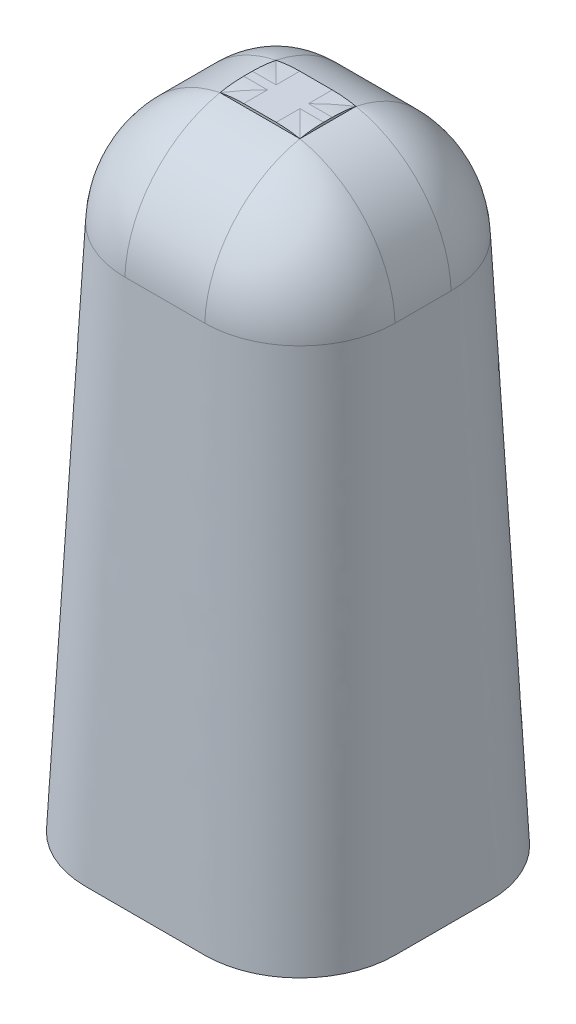
ISO-10303-21;
HEADER;
FILE_DESCRIPTION(('STEP AP214'),'2;1');
FILE_NAME('part.step','',(''),(''),'','','');
FILE_SCHEMA(('AUTOMOTIVE_DESIGN { 1 0 10303 214 1 1 1 1 }'));
ENDSEC;
DATA;
#1=APPLICATION_CONTEXT('core data for automotive mechanical design processes');
#2=APPLICATION_PROTOCOL_DEFINITION('international standard','automotive_design',2000,#1);
#3=PRODUCT_CONTEXT('',#1,'mechanical');
#4=PRODUCT('Part','Part','',(#3));
#5=PRODUCT_RELATED_PRODUCT_CATEGORY('part','',(#4));
#6=PRODUCT_DEFINITION_FORMATION('','',#4);
#7=PRODUCT_DEFINITION_CONTEXT('part definition',#1,'design');
#8=PRODUCT_DEFINITION('design','',#6,#7);
#9=PRODUCT_DEFINITION_SHAPE('','',#8);
#10=(LENGTH_UNIT() NAMED_UNIT(*) SI_UNIT(.MILLI.,.METRE.));
#11=(NAMED_UNIT(*) PLANE_ANGLE_UNIT() SI_UNIT($,.RADIAN.));
#12=(NAMED_UNIT(*) SI_UNIT($,.STERADIAN.) SOLID_ANGLE_UNIT());
#13=UNCERTAINTY_MEASURE_WITH_UNIT(LENGTH_MEASURE(1.E-05),#10,'distance_accuracy_value','');
#14=(GEOMETRIC_REPRESENTATION_CONTEXT(3) GLOBAL_UNCERTAINTY_ASSIGNED_CONTEXT((#13)) GLOBAL_UNIT_ASSIGNED_CONTEXT((#10,
#11,#12)) REPRESENTATION_CONTEXT('',''));
#15=CARTESIAN_POINT('',(0.,0.,0.));
#16=DIRECTION('',(0.,0.,1.));
#17=DIRECTION('',(1.,0.,0.));
#18=AXIS2_PLACEMENT_3D('',#15,#16,#17);
#19=CARTESIAN_POINT('',(1.67833,22.,0.181757005145817));
#20=DIRECTION('',(-1.,0.,0.));
#21=DIRECTION('',(0.,0.,1.));
#22=AXIS2_PLACEMENT_3D('',#19,#20,#21);
#23=CYLINDRICAL_SURFACE('',#22,5.);
#24=DIRECTION('',(-1.,0.,0.));
#25=VECTOR('',#24,1.);
#26=CARTESIAN_POINT('',(1.67833,26.8996777716425,1.17833));
#27=LINE('',#26,#25);
#28=CARTESIAN_POINT('',(-1.67833,26.8996777716425,1.17833));
#29=VERTEX_POINT('',#28);
#30=CARTESIAN_POINT('',(1.67833000000009,26.8996777716425,1.17833058698991));
#31=VERTEX_POINT('',#30);
#32=EDGE_CURVE('E353',#29,#31,#27,.F.);
#33=ORIENTED_EDGE('',*,*,#32,.F.);
#34=CARTESIAN_POINT('',(-1.67833,22.,0.181757005145817));
#35=DIRECTION('',(1.,0.,0.));
#36=DIRECTION('',(0.,0.,-1.));
#37=AXIS2_PLACEMENT_3D('',#34,#35,#36);
#38=CIRCLE('',#37,5.);
#39=CARTESIAN_POINT('',(-1.67833117398021,22.1850583025494,5.17833117397965));
#40=VERTEX_POINT('',#39);
#41=EDGE_CURVE('E914',#29,#40,#38,.T.);
#42=ORIENTED_EDGE('',*,*,#41,.T.);
#43=DIRECTION('',(1.,0.,0.));
#44=VECTOR('',#43,1.);
#45=CARTESIAN_POINT('',(-1.67833117397962,22.1850583025494,5.17833117397965));
#46=LINE('',#45,#44);
#47=CARTESIAN_POINT('',(1.67833117402719,22.1850583025494,5.17833117397965));
#48=VERTEX_POINT('',#47);
#49=EDGE_CURVE('E237',#40,#48,#46,.T.);
#50=ORIENTED_EDGE('',*,*,#49,.T.);
#51=CARTESIAN_POINT('',(1.67833,22.,0.181757005145817));
#52=DIRECTION('',(1.,0.,0.));
#53=DIRECTION('',(0.,0.,-1.));
#54=AXIS2_PLACEMENT_3D('',#51,#52,#53);
#55=CIRCLE('',#54,5.);
#56=EDGE_CURVE('E392',#31,#48,#55,.T.);
#57=ORIENTED_EDGE('',*,*,#56,.F.);
#58=EDGE_LOOP('',(#33,#42,#50,#57));
#59=FACE_BOUND('',#58,.T.);
#60=ADVANCED_FACE('F235',(#59),#23,.T.);
#61=CARTESIAN_POINT('',(-2.5,0.,-2.));
#62=DIRECTION('',(0.,1.,0.));
#63=DIRECTION('',(0.,0.,1.));
#64=AXIS2_PLACEMENT_3D('',#61,#62,#63);
#65=PLANE('',#64);
#66=CARTESIAN_POINT('',(-2.5,0.,-2.));
#67=DIRECTION('',(0.,1.,0.));
#68=DIRECTION('',(0.,0.,1.));
#69=AXIS2_PLACEMENT_3D('',#66,#67,#68);
#70=CIRCLE('',#69,4.);
#71=CARTESIAN_POINT('',(-2.49999999999997,0.,-6.));
#72=VERTEX_POINT('',#71);
#73=CARTESIAN_POINT('',(-6.5,0.,-1.99999999999997));
#74=VERTEX_POINT('',#73);
#75=EDGE_CURVE('E566',#72,#74,#70,.T.);
#76=ORIENTED_EDGE('',*,*,#75,.F.);
#77=DIRECTION('',(1.,0.,0.));
#78=VECTOR('',#77,1.);
#79=CARTESIAN_POINT('',(-2.49999999999997,0.,-6.));
#80=LINE('',#79,#78);
#81=CARTESIAN_POINT('',(2.49999999999997,0.,-6.));
#82=VERTEX_POINT('',#81);
#83=EDGE_CURVE('E500',#72,#82,#80,.T.);
#84=ORIENTED_EDGE('',*,*,#83,.T.);
#85=CARTESIAN_POINT('',(2.5,0.,-2.));
#86=DIRECTION('',(0.,1.,0.));
#87=DIRECTION('',(0.,0.,1.));
#88=AXIS2_PLACEMENT_3D('',#85,#86,#87);
#89=CIRCLE('',#88,4.);
#90=CARTESIAN_POINT('',(6.5,0.,-1.99999999999997));
#91=VERTEX_POINT('',#90);
#92=EDGE_CURVE('E571',#91,#82,#89,.T.);
#93=ORIENTED_EDGE('',*,*,#92,.F.);
#94=DIRECTION('',(0.,0.,1.));
#95=VECTOR('',#94,1.);
#96=CARTESIAN_POINT('',(6.5,0.,-1.99999999999997));
#97=LINE('',#96,#95);
#98=CARTESIAN_POINT('',(6.5,0.,1.99999999999997));
#99=VERTEX_POINT('',#98);
#100=EDGE_CURVE('E652',#91,#99,#97,.T.);
#101=ORIENTED_EDGE('',*,*,#100,.T.);
#102=CARTESIAN_POINT('',(2.5,0.,2.));
#103=DIRECTION('',(0.,1.,0.));
#104=DIRECTION('',(0.,0.,1.));
#105=AXIS2_PLACEMENT_3D('',#102,#103,#104);
#106=CIRCLE('',#105,4.);
#107=CARTESIAN_POINT('',(2.49999999999997,0.,6.));
#108=VERTEX_POINT('',#107);
#109=EDGE_CURVE('E650',#108,#99,#106,.T.);
#110=ORIENTED_EDGE('',*,*,#109,.F.);
#111=DIRECTION('',(1.,0.,0.));
#112=VECTOR('',#111,1.);
#113=CARTESIAN_POINT('',(-2.49999999999997,0.,6.));
#114=LINE('',#113,#112);
#115=CARTESIAN_POINT('',(-2.5,0.,6.));
#116=VERTEX_POINT('',#115);
#117=EDGE_CURVE('E644',#116,#108,#114,.T.);
#118=ORIENTED_EDGE('',*,*,#117,.F.);
#119=CARTESIAN_POINT('',(-2.5,0.,2.));
#120=DIRECTION('',(0.,1.,0.));
#121=DIRECTION('',(0.,0.,1.));
#122=AXIS2_PLACEMENT_3D('',#119,#120,#121);
#123=CIRCLE('',#122,4.);
#124=CARTESIAN_POINT('',(-6.5,0.,1.99999999999997));
#125=VERTEX_POINT('',#124);
#126=EDGE_CURVE('E638',#125,#116,#123,.T.);
#127=ORIENTED_EDGE('',*,*,#126,.F.);
#128=DIRECTION('',(0.,0.,1.));
#129=VECTOR('',#128,1.);
#130=CARTESIAN_POINT('',(-6.5,0.,-1.99999999999997));
#131=LINE('',#130,#129);
#132=EDGE_CURVE('E631',#74,#125,#131,.T.);
#133=ORIENTED_EDGE('',*,*,#132,.F.);
#134=EDGE_LOOP('',(#76,#84,#93,#101,#110,#118,#127,#133));
#135=FACE_BOUND('',#134,.T.);
#136=ADVANCED_FACE('F584',(#135),#65,.F.);
#137=CARTESIAN_POINT('',(-6.5,0.,-1.99999999876504));
#138=CARTESIAN_POINT('',(-5.67833117397965,22.1850583025494,-1.17833117294205));
#139=CARTESIAN_POINT('',(-6.5,0.,-1.71624345960132));
#140=CARTESIAN_POINT('',(-5.67833117397965,22.1850583025494,-0.939921264310687));
#141=CARTESIAN_POINT('',(-6.5,0.,-1.09374244107551));
#142=CARTESIAN_POINT('',(-5.67833117397964,22.1850583025494,-0.54245890887396));
#143=CARTESIAN_POINT('',(-6.5,0.,0.));
#144=CARTESIAN_POINT('',(-5.67833117397966,22.1850583025494,0.));
#145=CARTESIAN_POINT('',(-6.5,0.,1.09374244107551));
#146=CARTESIAN_POINT('',(-5.67833117397965,22.1850583025494,0.542458908873961));
#147=CARTESIAN_POINT('',(-6.5,0.,1.71624345960132));
#148=CARTESIAN_POINT('',(-5.67833117397965,22.1850583025494,0.939921264310688));
#149=CARTESIAN_POINT('',(-6.5,0.,2.57317556480351));
#150=CARTESIAN_POINT('',(-5.67833117397966,22.1850583025494,1.65990856577215));
#151=CARTESIAN_POINT('',(-6.25945428145019,0.,3.63310180142061));
#152=CARTESIAN_POINT('',(-5.50155413761933,22.1850583025493,2.6791236788504));
#153=CARTESIAN_POINT('',(-5.39086823553059,0.,4.89978435194632));
#154=CARTESIAN_POINT('',(-4.59560982485745,22.1850583025494,4.0835425688842));
#155=CARTESIAN_POINT('',(-4.12335089653319,0.,5.76307327082945));
#156=CARTESIAN_POINT('',(-3.19073278397759,22.1850583025493,4.99833929008047));
#157=CARTESIAN_POINT('',(-3.06840569519625,0.,6.));
#158=CARTESIAN_POINT('',(-2.16395151600476,22.1850583025494,5.17833117397965));
#159=CARTESIAN_POINT('',(-2.12814025662968,0.,6.));
#160=CARTESIAN_POINT('',(-1.36063088123626,22.1850583025494,5.17833117397965));
#161=CARTESIAN_POINT('',(-1.32925771033652,0.,6.));
#162=CARTESIAN_POINT('',(-0.792227512739455,22.1850583025494,5.17833117397965));
#163=CARTESIAN_POINT('',(0.,0.,6.));
#164=CARTESIAN_POINT('',(0.,22.1850583025494,5.17833117397965));
#165=CARTESIAN_POINT('',(1.32925771033649,0.,5.99999999999999));
#166=CARTESIAN_POINT('',(0.792227512739425,22.1850583025494,5.17833117397965));
#167=CARTESIAN_POINT('',(2.12814025662965,0.,6.));
#168=CARTESIAN_POINT('',(1.36063088123623,22.1850583025494,5.17833117397965));
#169=CARTESIAN_POINT('',(3.06840569519622,0.,6.));
#170=CARTESIAN_POINT('',(2.16395151600473,22.1850583025494,5.17833117397966));
#171=CARTESIAN_POINT('',(4.12335089653317,0.,5.76307327082945));
#172=CARTESIAN_POINT('',(3.19073278397757,22.1850583025494,4.99833929008049));
#173=CARTESIAN_POINT('',(5.39086823553059,0.,4.89978435194633));
#174=CARTESIAN_POINT('',(4.59560982485744,22.1850583025494,4.0835425688842));
#175=CARTESIAN_POINT('',(6.25945428145019,0.,3.63310180142062));
#176=CARTESIAN_POINT('',(5.50155413761932,22.1850583025494,2.67912367885042));
#177=CARTESIAN_POINT('',(6.5,0.,2.57317556480352));
#178=CARTESIAN_POINT('',(5.67833117397966,22.1850583025494,1.65990856577216));
#179=CARTESIAN_POINT('',(6.5,0.,1.71624345960132));
#180=CARTESIAN_POINT('',(5.67833117397965,22.1850583025494,0.939921264310688));
#181=CARTESIAN_POINT('',(6.5,0.,1.09374244107551));
#182=CARTESIAN_POINT('',(5.67833117397965,22.1850583025493,0.54245890887396));
#183=CARTESIAN_POINT('',(6.49999999999999,0.,0.));
#184=CARTESIAN_POINT('',(5.67833117397965,22.1850583025494,0.));
#185=CARTESIAN_POINT('',(6.50000000000001,0.,-1.09374244107551));
#186=CARTESIAN_POINT('',(5.67833117397965,22.1850583025493,-0.542458908873959));
#187=CARTESIAN_POINT('',(6.5,0.,-1.71624345960132));
#188=CARTESIAN_POINT('',(5.67833117397965,22.1850583025494,-0.939921264310687));
#189=CARTESIAN_POINT('',(6.5,0.,-2.57317556480352));
#190=CARTESIAN_POINT('',(5.67833117397966,22.1850583025494,-1.65990856577216));
#191=CARTESIAN_POINT('',(6.25945428145019,0.,-3.63310180142061));
#192=CARTESIAN_POINT('',(5.50155413761932,22.1850583025494,-2.6791236788504));
#193=CARTESIAN_POINT('',(5.39086823553059,0.,-4.89978435194633));
#194=CARTESIAN_POINT('',(4.59560982485744,22.1850583025494,-4.08354256888422));
#195=CARTESIAN_POINT('',(4.12335089653317,0.,-5.76307327082945));
#196=CARTESIAN_POINT('',(3.19073278397757,22.1850583025494,-4.99833929008048));
#197=CARTESIAN_POINT('',(3.06840569519623,0.,-6.));
#198=CARTESIAN_POINT('',(2.16395151600473,22.1850583025494,-5.17833117397966));
#199=CARTESIAN_POINT('',(2.12814025662966,0.,-6.));
#200=CARTESIAN_POINT('',(1.36063088123623,22.1850583025494,-5.17833117397965));
#201=CARTESIAN_POINT('',(1.32925771033649,0.,-5.99999999999998));
#202=CARTESIAN_POINT('',(0.792227512739432,22.1850583025494,-5.17833117397966));
#203=CARTESIAN_POINT('',(0.,0.,-6.00000000000002));
#204=CARTESIAN_POINT('',(0.,22.1850583025494,-5.17833117397965));
#205=CARTESIAN_POINT('',(-1.3292577103365,0.,-5.99999999999998));
#206=CARTESIAN_POINT('',(-0.792227512739434,22.1850583025494,-5.17833117397966));
#207=CARTESIAN_POINT('',(-2.12814025662965,0.,-6.));
#208=CARTESIAN_POINT('',(-1.36063088123623,22.1850583025494,-5.17833117397965));
#209=CARTESIAN_POINT('',(-3.06840569519622,0.,-6.));
#210=CARTESIAN_POINT('',(-2.16395151600473,22.1850583025494,-5.17833117397966));
#211=CARTESIAN_POINT('',(-4.12335089653317,0.,-5.76307327082946));
#212=CARTESIAN_POINT('',(-3.19073278397757,22.1850583025494,-4.99833929008048));
#213=CARTESIAN_POINT('',(-5.39086823553059,0.,-4.89978435194633));
#214=CARTESIAN_POINT('',(-4.59560982485743,22.1850583025494,-4.08354256888422));
#215=CARTESIAN_POINT('',(-6.25945428145018,0.,-3.63310180142062));
#216=CARTESIAN_POINT('',(-5.50155413761932,22.1850583025494,-2.67912367885041));
#217=CARTESIAN_POINT('',(-6.5,0.,-2.57317556480352));
#218=CARTESIAN_POINT('',(-5.67833117397966,22.1850583025494,-1.65990856577216));
#219=CARTESIAN_POINT('',(-6.5,0.,-1.99999999876504));
#220=CARTESIAN_POINT('',(-5.67833117397965,22.1850583025494,-1.17833117294205));
#221=B_SPLINE_SURFACE_WITH_KNOTS('',3,1,((#137,#138),(#139,#140),(#141,#142),(#143,#144),(#145,
#146),(#147,#148),(#149,#150),(#151,#152),(#153,#154),(#155,#156),(#157,#158),(#159,#160),(#161,
#162),(#163,#164),(#165,#166),(#167,#168),(#169,#170),(#171,#172),(#173,#174),(#175,#176),(#177,
#178),(#179,#180),(#181,#182),(#183,#184),(#185,#186),(#187,#188),(#189,#190),(#191,#192),(#193,
#194),(#195,#196),(#197,#198),(#199,#200),(#201,#202),(#203,#204),(#205,#206),(#207,#208),(#209,
#210),(#211,#212),(#213,#214),(#215,#216),(#217,#218),(#219,#220)),.UNSPECIFIED.,.T.,.F.,.F.,(4,
1,1,1,2,1,1,1,2,1,1,1,2,1,1,1,2,1,1,1,2,1,1,1,2,1,1,1,2,1,1,1,4),(2,2),(0.,0.0196497725721527,
0.0392995451443053,0.058949317716458,0.0785990902886106,0.118290755367992,0.157982420447373,
0.197674085526755,0.237365750606136,0.263332647875221,0.289299545144305,0.315266442413389,
0.341233339682474,0.380925004761855,0.420616669841237,0.460308334920618,0.5,0.519649772572153,
0.539299545144305,0.558949317716458,0.578599090288611,0.618290755367992,0.657982420447374,
0.697674085526755,0.737365750606137,0.763332647875221,0.789299545144305,0.81526644241339,
0.841233339682474,0.880925004761855,0.920616669841237,0.960308334920618,1.),(0.,1.),.UNSPECIFIED.);
#222=DIRECTION('',(1.,0.,0.));
#223=VECTOR('',#222,1.);
#224=CARTESIAN_POINT('',(-1.67833117397962,22.1850583025494,-5.17833117397965));
#225=LINE('',#224,#223);
#226=CARTESIAN_POINT('',(-1.67833,22.1850583025494,-5.17833117397965));
#227=VERTEX_POINT('',#226);
#228=CARTESIAN_POINT('',(1.67833,22.1850583025494,-5.17833117397965));
#229=VERTEX_POINT('',#228);
#230=EDGE_CURVE('E698',#227,#229,#225,.T.);
#231=CARTESIAN_POINT('',(1.67833117397965,22.1850583025494,-1.17833117397965));
#232=DIRECTION('',(0.,1.,0.));
#233=DIRECTION('',(0.,0.,1.));
#234=AXIS2_PLACEMENT_3D('',#231,#232,#233);
#235=CIRCLE('',#234,4.);
#236=CARTESIAN_POINT('',(5.67833117397965,22.1850583025494,-1.17833));
#237=VERTEX_POINT('',#236);
#238=EDGE_CURVE('E468',#237,#229,#235,.T.);
#239=DIRECTION('',(0.,0.,1.));
#240=VECTOR('',#239,1.);
#241=CARTESIAN_POINT('',(5.67833117397965,22.1850583025494,-1.17833117397962));
#242=LINE('',#241,#240);
#243=CARTESIAN_POINT('',(5.67833117397965,22.1850583025494,1.17833));
#244=VERTEX_POINT('',#243);
#245=EDGE_CURVE('E543',#237,#244,#242,.T.);
#246=CARTESIAN_POINT('',(1.67833117397965,22.1850583025494,1.17833117397965));
#247=DIRECTION('',(0.,1.,0.));
#248=DIRECTION('',(0.,0.,1.));
#249=AXIS2_PLACEMENT_3D('',#246,#247,#248);
#250=CIRCLE('',#249,4.);
#251=EDGE_CURVE('E406',#48,#244,#250,.T.);
#252=CARTESIAN_POINT('',(-1.67833117397965,22.1850583025494,1.17833117397965));
#253=DIRECTION('',(0.,1.,0.));
#254=DIRECTION('',(0.,0.,1.));
#255=AXIS2_PLACEMENT_3D('',#252,#253,#254);
#256=CIRCLE('',#255,4.);
#257=CARTESIAN_POINT('',(-5.67833117397965,22.1850583025494,1.17833));
#258=VERTEX_POINT('',#257);
#259=EDGE_CURVE('E505',#258,#40,#256,.T.);
#260=DIRECTION('',(0.,0.,1.));
#261=VECTOR('',#260,1.);
#262=CARTESIAN_POINT('',(-5.67833117397965,22.1850583025494,-1.17833117397962));
#263=LINE('',#262,#261);
#264=CARTESIAN_POINT('',(-5.67833117397965,22.1850583025494,-1.17833117387391));
#265=VERTEX_POINT('',#264);
#266=EDGE_CURVE('E432',#265,#258,#263,.T.);
#267=CARTESIAN_POINT('',(-1.67833117397965,22.1850583025494,-1.17833117397965));
#268=DIRECTION('',(0.,1.,0.));
#269=DIRECTION('',(0.,0.,1.));
#270=AXIS2_PLACEMENT_3D('',#267,#268,#269);
#271=CIRCLE('',#270,4.);
#272=EDGE_CURVE('E495',#227,#265,#271,.T.);
#273=CARTESIAN_POINT('',(0.,0.,6.));
#274=CARTESIAN_POINT('',(0.,22.1850583025494,5.17833117397965));
#275=CARTESIAN_POINT('',(0.443085903445487,0.,6.));
#276=CARTESIAN_POINT('',(0.264075837579799,22.1850583025494,5.17833117397965));
#277=CARTESIAN_POINT('',(1.32925771033649,0.,5.99999999999999));
#278=CARTESIAN_POINT('',(0.792227512739425,22.1850583025494,5.17833117397965));
#279=CARTESIAN_POINT('',(2.12814025662965,0.,6.));
#280=CARTESIAN_POINT('',(1.36063088123623,22.1850583025494,5.17833117397965));
#281=CARTESIAN_POINT('',(3.06840569519622,0.,6.));
#282=CARTESIAN_POINT('',(2.16395151600473,22.1850583025494,5.17833117397966));
#283=CARTESIAN_POINT('',(4.12335089653317,0.,5.76307327082945));
#284=CARTESIAN_POINT('',(3.19073278397757,22.1850583025494,4.99833929008049));
#285=CARTESIAN_POINT('',(5.39086823553059,0.,4.89978435194633));
#286=CARTESIAN_POINT('',(4.59560982485744,22.1850583025494,4.0835425688842));
#287=CARTESIAN_POINT('',(6.25945428145019,0.,3.63310180142062));
#288=CARTESIAN_POINT('',(5.50155413761932,22.1850583025494,2.67912367885042));
#289=CARTESIAN_POINT('',(6.5,0.,2.57317556480352));
#290=CARTESIAN_POINT('',(5.67833117397966,22.1850583025494,1.65990856577216));
#291=CARTESIAN_POINT('',(6.5,0.,1.71624345960132));
#292=CARTESIAN_POINT('',(5.67833117397965,22.1850583025494,0.939921264310688));
#293=CARTESIAN_POINT('',(6.5,0.,1.09374244107551));
#294=CARTESIAN_POINT('',(5.67833117397965,22.1850583025493,0.54245890887396));
#295=CARTESIAN_POINT('',(6.49999999999999,0.,0.));
#296=CARTESIAN_POINT('',(5.67833117397965,22.1850583025494,0.));
#297=CARTESIAN_POINT('',(6.50000000000001,0.,-1.09374244107551));
#298=CARTESIAN_POINT('',(5.67833117397965,22.1850583025493,-0.542458908873959));
#299=CARTESIAN_POINT('',(6.5,0.,-1.71624345960132));
#300=CARTESIAN_POINT('',(5.67833117397965,22.1850583025494,-0.939921264310687));
#301=CARTESIAN_POINT('',(6.5,0.,-2.57317556480352));
#302=CARTESIAN_POINT('',(5.67833117397966,22.1850583025494,-1.65990856577216));
#303=CARTESIAN_POINT('',(6.25945428145019,0.,-3.63310180142061));
#304=CARTESIAN_POINT('',(5.50155413761932,22.1850583025494,-2.6791236788504));
#305=CARTESIAN_POINT('',(5.39086823553059,0.,-4.89978435194633));
#306=CARTESIAN_POINT('',(4.59560982485744,22.1850583025494,-4.08354256888422));
#307=CARTESIAN_POINT('',(4.12335089653317,0.,-5.76307327082945));
#308=CARTESIAN_POINT('',(3.19073278397757,22.1850583025494,-4.99833929008048));
#309=CARTESIAN_POINT('',(3.06840569519623,0.,-6.));
#310=CARTESIAN_POINT('',(2.16395151600473,22.1850583025494,-5.17833117397966));
#311=CARTESIAN_POINT('',(2.12814025662966,0.,-6.));
#312=CARTESIAN_POINT('',(1.36063088123623,22.1850583025494,-5.17833117397965));
#313=CARTESIAN_POINT('',(1.32925771033649,0.,-5.99999999999998));
#314=CARTESIAN_POINT('',(0.792227512739432,22.1850583025494,-5.17833117397966));
#315=CARTESIAN_POINT('',(0.,0.,-6.00000000000002));
#316=CARTESIAN_POINT('',(0.,22.1850583025494,-5.17833117397965));
#317=CARTESIAN_POINT('',(-1.3292577103365,0.,-5.99999999999998));
#318=CARTESIAN_POINT('',(-0.792227512739434,22.1850583025494,-5.17833117397966));
#319=CARTESIAN_POINT('',(-2.12814025662965,0.,-6.));
#320=CARTESIAN_POINT('',(-1.36063088123623,22.1850583025494,-5.17833117397965));
#321=CARTESIAN_POINT('',(-3.06840569519622,0.,-6.));
#322=CARTESIAN_POINT('',(-2.16395151600473,22.1850583025494,-5.17833117397966));
#323=CARTESIAN_POINT('',(-4.12335089653317,0.,-5.76307327082946));
#324=CARTESIAN_POINT('',(-3.19073278397757,22.1850583025494,-4.99833929008048));
#325=CARTESIAN_POINT('',(-5.39086823553059,0.,-4.89978435194633));
#326=CARTESIAN_POINT('',(-4.59560982485743,22.1850583025494,-4.08354256888422));
#327=CARTESIAN_POINT('',(-6.25945428145018,0.,-3.63310180142062));
#328=CARTESIAN_POINT('',(-5.50155413761932,22.1850583025494,-2.67912367885041));
#329=CARTESIAN_POINT('',(-6.5,0.,-2.57317556480352));
#330=CARTESIAN_POINT('',(-5.67833117397966,22.1850583025494,-1.65990856577216));
#331=CARTESIAN_POINT('',(-6.5,0.,-1.71624345960132));
#332=CARTESIAN_POINT('',(-5.67833117397965,22.1850583025494,-0.939921264310687));
#333=CARTESIAN_POINT('',(-6.5,0.,-1.09374244107551));
#334=CARTESIAN_POINT('',(-5.67833117397964,22.1850583025494,-0.54245890887396));
#335=CARTESIAN_POINT('',(-6.5,0.,0.));
#336=CARTESIAN_POINT('',(-5.67833117397966,22.1850583025494,0.));
#337=CARTESIAN_POINT('',(-6.5,0.,1.09374244107551));
#338=CARTESIAN_POINT('',(-5.67833117397965,22.1850583025494,0.542458908873961));
#339=CARTESIAN_POINT('',(-6.5,0.,1.71624345960132));
#340=CARTESIAN_POINT('',(-5.67833117397965,22.1850583025494,0.939921264310688));
#341=CARTESIAN_POINT('',(-6.5,0.,2.57317556480351));
#342=CARTESIAN_POINT('',(-5.67833117397966,22.1850583025494,1.65990856577215));
#343=CARTESIAN_POINT('',(-6.25945428145019,0.,3.63310180142061));
#344=CARTESIAN_POINT('',(-5.50155413761933,22.1850583025493,2.6791236788504));
#345=CARTESIAN_POINT('',(-5.39086823553059,0.,4.89978435194632));
#346=CARTESIAN_POINT('',(-4.59560982485745,22.1850583025494,4.0835425688842));
#347=CARTESIAN_POINT('',(-4.12335089653319,0.,5.76307327082945));
#348=CARTESIAN_POINT('',(-3.19073278397759,22.1850583025493,4.99833929008047));
#349=CARTESIAN_POINT('',(-3.06840569519625,0.,6.));
#350=CARTESIAN_POINT('',(-2.16395151600476,22.1850583025494,5.17833117397965));
#351=CARTESIAN_POINT('',(-2.12814025662968,0.,6.));
#352=CARTESIAN_POINT('',(-1.36063088123626,22.1850583025494,5.17833117397965));
#353=CARTESIAN_POINT('',(-1.32925771033652,0.,6.));
#354=CARTESIAN_POINT('',(-0.792227512739455,22.1850583025494,5.17833117397965));
#355=CARTESIAN_POINT('',(-0.443085903445515,0.,6.));
#356=CARTESIAN_POINT('',(-0.264075837579828,22.1850583025494,5.17833117397965));
#357=CARTESIAN_POINT('',(0.,0.,6.));
#358=CARTESIAN_POINT('',(0.,22.1850583025494,5.17833117397965));
#359=B_SPLINE_SURFACE_WITH_KNOTS('',3,1,((#273,#274),(#275,#276),(#277,#278),(#279,#280),(#281,
#282),(#283,#284),(#285,#286),(#287,#288),(#289,#290),(#291,#292),(#293,#294),(#295,#296),(#297,
#298),(#299,#300),(#301,#302),(#303,#304),(#305,#306),(#307,#308),(#309,#310),(#311,#312),(#313,
#314),(#315,#316),(#317,#318),(#319,#320),(#321,#322),(#323,#324),(#325,#326),(#327,#328),(#329,
#330),(#331,#332),(#333,#334),(#335,#336),(#337,#338),(#339,#340),(#341,#342),(#343,#344),(#345,
#346),(#347,#348),(#349,#350),(#351,#352),(#353,#354),(#355,#356),(#357,#358)),.UNSPECIFIED.,
.T.,.F.,.F.,(4,1,2,1,1,1,2,1,1,1,2,1,1,1,2,1,1,1,2,1,1,1,2,1,1,1,2,1,1,1,2,1,4),(2,2),
(0.289299545144305,0.315266442413389,0.341233339682474,0.380925004761855,0.420616669841237,
0.460308334920618,0.5,0.519649772572153,0.539299545144305,0.558949317716458,0.578599090288611,
0.618290755367992,0.657982420447374,0.697674085526755,0.737365750606137,0.763332647875221,
0.789299545144305,0.81526644241339,0.841233339682474,0.880925004761855,0.920616669841237,
0.960308334920618,1.,1.01964977257215,1.03929954514431,1.05894931771646,1.07859909028861,
1.11829075536799,1.15798242044737,1.19767408552675,1.23736575060614,1.26333264787522,
1.28929954514431),(0.,1.),.UNSPECIFIED.);
#360=ORIENTED_EDGE('',*,*,#75,.T.);
#361=ORIENTED_EDGE('',*,*,#132,.T.);
#362=ORIENTED_EDGE('',*,*,#126,.T.);
#363=ORIENTED_EDGE('',*,*,#117,.T.);
#364=ORIENTED_EDGE('',*,*,#109,.T.);
#365=ORIENTED_EDGE('',*,*,#100,.F.);
#366=ORIENTED_EDGE('',*,*,#92,.T.);
#367=ORIENTED_EDGE('',*,*,#83,.F.);
#368=EDGE_LOOP('',(#360,#361,#362,#363,#364,#365,#366,#367));
#369=FACE_BOUND('',#368,.T.);
#370=ORIENTED_EDGE('',*,*,#230,.T.);
#371=ORIENTED_EDGE('',*,*,#238,.F.);
#372=ORIENTED_EDGE('',*,*,#245,.T.);
#373=ORIENTED_EDGE('',*,*,#251,.F.);
#374=ORIENTED_EDGE('',*,*,#49,.F.);
#375=ORIENTED_EDGE('',*,*,#259,.F.);
#376=ORIENTED_EDGE('',*,*,#266,.F.);
#377=ORIENTED_EDGE('',*,*,#272,.F.);
#378=EDGE_LOOP('',(#370,#371,#372,#373,#374,#375,#376,#377));
#379=FACE_BOUND('',#378,.T.);
#380=ADVANCED_FACE('F234',(#369,#379),#359,.T.);
#381=CARTESIAN_POINT('',(1.67833,22.,-0.181757005145817));
#382=DIRECTION('',(-1.,0.,0.));
#383=DIRECTION('',(0.,0.,1.));
#384=AXIS2_PLACEMENT_3D('',#381,#382,#383);
#385=CYLINDRICAL_SURFACE('',#384,5.);
#386=CARTESIAN_POINT('',(-1.67833,22.,-0.181757005145817));
#387=DIRECTION('',(1.,0.,0.));
#388=DIRECTION('',(0.,0.,-1.));
#389=AXIS2_PLACEMENT_3D('',#386,#387,#388);
#390=CIRCLE('',#389,5.);
#391=CARTESIAN_POINT('',(-1.67833,26.8996777716425,-1.17833058698983));
#392=VERTEX_POINT('',#391);
#393=EDGE_CURVE('E489',#227,#392,#390,.T.);
#394=ORIENTED_EDGE('',*,*,#393,.T.);
#395=DIRECTION('',(-1.,0.,0.));
#396=VECTOR('',#395,1.);
#397=CARTESIAN_POINT('',(1.67833,26.8996777716425,-1.17833));
#398=LINE('',#397,#396);
#399=CARTESIAN_POINT('',(1.67833058699,26.8996777716425,-1.17833000000017));
#400=VERTEX_POINT('',#399);
#401=EDGE_CURVE('E365',#392,#400,#398,.F.);
#402=ORIENTED_EDGE('',*,*,#401,.T.);
#403=CARTESIAN_POINT('',(1.67833,22.,-0.181757005145817));
#404=DIRECTION('',(1.,0.,0.));
#405=DIRECTION('',(0.,0.,-1.));
#406=AXIS2_PLACEMENT_3D('',#403,#404,#405);
#407=CIRCLE('',#406,5.);
#408=EDGE_CURVE('E712',#229,#400,#407,.T.);
#409=ORIENTED_EDGE('',*,*,#408,.F.);
#410=ORIENTED_EDGE('',*,*,#230,.F.);
#411=EDGE_LOOP('',(#394,#402,#409,#410));
#412=FACE_BOUND('',#411,.T.);
#413=ADVANCED_FACE('F715',(#412),#385,.T.);
#414=CARTESIAN_POINT('',(-0.681757005145817,22.,-1.17833));
#415=DIRECTION('',(0.,0.,1.));
#416=DIRECTION('',(1.,0.,0.));
#417=AXIS2_PLACEMENT_3D('',#414,#415,#416);
#418=CYLINDRICAL_SURFACE('',#417,5.);
#419=DIRECTION('',(0.,0.,1.));
#420=VECTOR('',#419,1.);
#421=CARTESIAN_POINT('',(-1.67833,26.8996777716425,-1.17833));
#422=LINE('',#421,#420);
#423=EDGE_CURVE('E244',#392,#29,#422,.T.);
#424=ORIENTED_EDGE('',*,*,#423,.F.);
#425=CARTESIAN_POINT('',(-0.681757005145817,22.,-1.17833));
#426=DIRECTION('',(0.,0.,-1.));
#427=DIRECTION('',(-1.,0.,0.));
#428=AXIS2_PLACEMENT_3D('',#425,#426,#427);
#429=CIRCLE('',#428,5.);
#430=EDGE_CURVE('E420',#392,#265,#429,.F.);
#431=ORIENTED_EDGE('',*,*,#430,.T.);
#432=ORIENTED_EDGE('',*,*,#266,.T.);
#433=CARTESIAN_POINT('',(-0.681757005145817,22.,1.17833));
#434=DIRECTION('',(0.,0.,-1.));
#435=DIRECTION('',(-1.,0.,0.));
#436=AXIS2_PLACEMENT_3D('',#433,#434,#435);
#437=CIRCLE('',#436,5.);
#438=EDGE_CURVE('E412',#29,#258,#437,.F.);
#439=ORIENTED_EDGE('',*,*,#438,.F.);
#440=EDGE_LOOP('',(#424,#431,#432,#439));
#441=FACE_BOUND('',#440,.T.);
#442=ADVANCED_FACE('F452',(#441),#418,.T.);
#443=CARTESIAN_POINT('',(1.67833,27.,0.));
#444=DIRECTION('',(0.,1.,0.));
#445=DIRECTION('',(0.,0.,1.));
#446=AXIS2_PLACEMENT_3D('',#443,#444,#445);
#447=PLANE('',#446);
#448=DIRECTION('',(-1.,0.,0.));
#449=VECTOR('',#448,1.);
#450=CARTESIAN_POINT('',(1.67833,27.,0.181757005145783));
#451=LINE('',#450,#449);
#452=CARTESIAN_POINT('',(-0.681757005145782,27.,0.181757005145783));
#453=VERTEX_POINT('',#452);
#454=CARTESIAN_POINT('',(-1.67833,27.,0.181757005145783));
#455=VERTEX_POINT('',#454);
#456=EDGE_CURVE('E895',#453,#455,#451,.T.);
#457=ORIENTED_EDGE('',*,*,#456,.F.);
#458=DIRECTION('',(0.,0.,1.));
#459=VECTOR('',#458,1.);
#460=CARTESIAN_POINT('',(-0.681757005145782,27.,-1.17833));
#461=LINE('',#460,#459);
#462=CARTESIAN_POINT('',(-0.681757005145782,27.,1.17833));
#463=VERTEX_POINT('',#462);
#464=EDGE_CURVE('E892',#453,#463,#461,.T.);
#465=ORIENTED_EDGE('',*,*,#464,.T.);
#466=DIRECTION('',(1.,0.,0.));
#467=VECTOR('',#466,1.);
#468=CARTESIAN_POINT('',(0.,27.,1.17833));
#469=LINE('',#468,#467);
#470=CARTESIAN_POINT('',(0.681757005145782,27.,1.17833));
#471=VERTEX_POINT('',#470);
#472=EDGE_CURVE('E430',#463,#471,#469,.T.);
#473=ORIENTED_EDGE('',*,*,#472,.T.);
#474=DIRECTION('',(0.,0.,1.));
#475=VECTOR('',#474,1.);
#476=CARTESIAN_POINT('',(0.681757005145782,27.,-1.17833));
#477=LINE('',#476,#475);
#478=CARTESIAN_POINT('',(0.681757005145782,27.,0.181757005145783));
#479=VERTEX_POINT('',#478);
#480=EDGE_CURVE('E371',#479,#471,#477,.T.);
#481=ORIENTED_EDGE('',*,*,#480,.F.);
#482=CARTESIAN_POINT('',(1.67833,27.,0.181757005145783));
#483=VERTEX_POINT('',#482);
#484=EDGE_CURVE('E379',#483,#479,#451,.T.);
#485=ORIENTED_EDGE('',*,*,#484,.F.);
#486=DIRECTION('',(0.,0.,-1.));
#487=VECTOR('',#486,1.);
#488=CARTESIAN_POINT('',(1.67833,27.,0.));
#489=LINE('',#488,#487);
#490=CARTESIAN_POINT('',(1.67833,27.,-0.181757005145783));
#491=VERTEX_POINT('',#490);
#492=EDGE_CURVE('E386',#483,#491,#489,.T.);
#493=ORIENTED_EDGE('',*,*,#492,.T.);
#494=DIRECTION('',(-1.,0.,0.));
#495=VECTOR('',#494,1.);
#496=CARTESIAN_POINT('',(1.67833,27.,-0.181757005145783));
#497=LINE('',#496,#495);
#498=CARTESIAN_POINT('',(0.681757005145782,27.,-0.181757005145817));
#499=VERTEX_POINT('',#498);
#500=EDGE_CURVE('E896',#491,#499,#497,.T.);
#501=ORIENTED_EDGE('',*,*,#500,.T.);
#502=CARTESIAN_POINT('',(0.681757005145782,27.,-1.17833));
#503=VERTEX_POINT('',#502);
#504=EDGE_CURVE('E898',#503,#499,#477,.T.);
#505=ORIENTED_EDGE('',*,*,#504,.F.);
#506=DIRECTION('',(1.,0.,0.));
#507=VECTOR('',#506,1.);
#508=CARTESIAN_POINT('',(0.,27.,-1.17833));
#509=LINE('',#508,#507);
#510=CARTESIAN_POINT('',(-0.681757005145782,27.,-1.17833));
#511=VERTEX_POINT('',#510);
#512=EDGE_CURVE('E425',#511,#503,#509,.T.);
#513=ORIENTED_EDGE('',*,*,#512,.F.);
#514=CARTESIAN_POINT('',(-0.681757005145782,27.,-0.181757005145817));
#515=VERTEX_POINT('',#514);
#516=EDGE_CURVE('E361',#511,#515,#461,.T.);
#517=ORIENTED_EDGE('',*,*,#516,.T.);
#518=CARTESIAN_POINT('',(-1.67833,27.,-0.181757005145783));
#519=VERTEX_POINT('',#518);
#520=EDGE_CURVE('E711',#515,#519,#497,.T.);
#521=ORIENTED_EDGE('',*,*,#520,.T.);
#522=DIRECTION('',(0.,0.,-1.));
#523=VECTOR('',#522,1.);
#524=CARTESIAN_POINT('',(-1.67833,27.,0.));
#525=LINE('',#524,#523);
#526=EDGE_CURVE('E382',#455,#519,#525,.T.);
#527=ORIENTED_EDGE('',*,*,#526,.F.);
#528=EDGE_LOOP('',(#457,#465,#473,#481,#485,#493,#501,#505,#513,#517,#521,#527));
#529=FACE_BOUND('',#528,.T.);
#530=ADVANCED_FACE('F594',(#529),#447,.T.);
#531=CARTESIAN_POINT('',(-1.67833,0.,0.));
#532=DIRECTION('',(1.,0.,0.));
#533=DIRECTION('',(0.,0.,-1.));
#534=AXIS2_PLACEMENT_3D('',#531,#532,#533);
#535=PLANE('',#534);
#536=EDGE_CURVE('E946',#392,#519,#390,.T.);
#537=ORIENTED_EDGE('',*,*,#536,.F.);
#538=ORIENTED_EDGE('',*,*,#423,.T.);
#539=EDGE_CURVE('E254',#455,#29,#38,.T.);
#540=ORIENTED_EDGE('',*,*,#539,.F.);
#541=ORIENTED_EDGE('',*,*,#526,.T.);
#542=EDGE_LOOP('',(#537,#538,#540,#541));
#543=FACE_BOUND('',#542,.T.);
#544=ADVANCED_FACE('F759',(#543),#535,.F.);
#545=ORIENTED_EDGE('',*,*,#520,.F.);
#546=CARTESIAN_POINT('',(-0.681757005145817,22.,-0.181757005145817));
#547=DIRECTION('',(-0.707106781186547,0.,0.707106781186547));
#548=DIRECTION('',(-0.707106781186547,0.,-0.707106781186547));
#549=AXIS2_PLACEMENT_3D('',#546,#547,#548);
#550=ELLIPSE('',#549,7.07106781186547,5.);
#551=EDGE_CURVE('E901',#515,#392,#550,.T.);
#552=ORIENTED_EDGE('',*,*,#551,.T.);
#553=ORIENTED_EDGE('',*,*,#536,.T.);
#554=EDGE_LOOP('',(#545,#552,#553));
#555=FACE_BOUND('',#554,.T.);
#556=ADVANCED_FACE('F746',(#555),#385,.T.);
#557=ORIENTED_EDGE('',*,*,#539,.T.);
#558=CARTESIAN_POINT('',(-0.681757005145817,22.,0.181757005145817));
#559=DIRECTION('',(-0.707106781186547,0.,-0.707106781186547));
#560=DIRECTION('',(-0.707106781186547,0.,0.707106781186547));
#561=AXIS2_PLACEMENT_3D('',#558,#559,#560);
#562=ELLIPSE('',#561,7.07106781186547,5.);
#563=EDGE_CURVE('E260',#29,#453,#562,.T.);
#564=ORIENTED_EDGE('',*,*,#563,.T.);
#565=ORIENTED_EDGE('',*,*,#456,.T.);
#566=EDGE_LOOP('',(#557,#564,#565));
#567=FACE_BOUND('',#566,.T.);
#568=ADVANCED_FACE('F738',(#567),#23,.T.);
#569=CARTESIAN_POINT('',(1.67833,0.,0.));
#570=DIRECTION('',(1.,0.,0.));
#571=DIRECTION('',(0.,0.,-1.));
#572=AXIS2_PLACEMENT_3D('',#569,#570,#571);
#573=PLANE('',#572);
#574=DIRECTION('',(0.,0.,1.));
#575=VECTOR('',#574,1.);
#576=CARTESIAN_POINT('',(1.67833,26.8996777716425,-1.17833));
#577=LINE('',#576,#575);
#578=EDGE_CURVE('E12',#400,#31,#577,.T.);
#579=ORIENTED_EDGE('',*,*,#578,.F.);
#580=EDGE_CURVE('E388',#400,#491,#407,.T.);
#581=ORIENTED_EDGE('',*,*,#580,.T.);
#582=ORIENTED_EDGE('',*,*,#492,.F.);
#583=EDGE_CURVE('E377',#483,#31,#55,.T.);
#584=ORIENTED_EDGE('',*,*,#583,.T.);
#585=EDGE_LOOP('',(#579,#581,#582,#584));
#586=FACE_BOUND('',#585,.T.);
#587=ADVANCED_FACE('F387',(#586),#573,.T.);
#588=ORIENTED_EDGE('',*,*,#580,.F.);
#589=CARTESIAN_POINT('',(0.681757005145817,22.,-0.181757005145817));
#590=DIRECTION('',(-0.707106781186547,0.,-0.707106781186547));
#591=DIRECTION('',(-0.707106781186547,0.,0.707106781186547));
#592=AXIS2_PLACEMENT_3D('',#589,#590,#591);
#593=ELLIPSE('',#592,7.07106781186547,5.);
#594=EDGE_CURVE('E385',#400,#499,#593,.F.);
#595=ORIENTED_EDGE('',*,*,#594,.T.);
#596=ORIENTED_EDGE('',*,*,#500,.F.);
#597=EDGE_LOOP('',(#588,#595,#596));
#598=FACE_BOUND('',#597,.T.);
#599=ADVANCED_FACE('F749',(#598),#385,.T.);
#600=ORIENTED_EDGE('',*,*,#484,.T.);
#601=CARTESIAN_POINT('',(0.681757005145817,22.,0.181757005145817));
#602=DIRECTION('',(-0.707106781186547,0.,0.707106781186547));
#603=DIRECTION('',(-0.707106781186547,0.,-0.707106781186547));
#604=AXIS2_PLACEMENT_3D('',#601,#602,#603);
#605=ELLIPSE('',#604,7.07106781186547,5.);
#606=EDGE_CURVE('E367',#479,#31,#605,.F.);
#607=ORIENTED_EDGE('',*,*,#606,.T.);
#608=ORIENTED_EDGE('',*,*,#583,.F.);
#609=EDGE_LOOP('',(#600,#607,#608));
#610=FACE_BOUND('',#609,.T.);
#611=ADVANCED_FACE('F380',(#610),#23,.T.);
#612=CARTESIAN_POINT('',(0.681757005145817,22.,-1.17833));
#613=DIRECTION('',(0.,0.,1.));
#614=DIRECTION('',(1.,0.,0.));
#615=AXIS2_PLACEMENT_3D('',#612,#613,#614);
#616=CYLINDRICAL_SURFACE('',#615,5.);
#617=CARTESIAN_POINT('',(0.681757005145817,22.,-1.17833));
#618=DIRECTION('',(0.,0.,-1.));
#619=DIRECTION('',(-1.,0.,0.));
#620=AXIS2_PLACEMENT_3D('',#617,#618,#619);
#621=CIRCLE('',#620,5.);
#622=EDGE_CURVE('E396',#237,#400,#621,.F.);
#623=ORIENTED_EDGE('',*,*,#622,.T.);
#624=ORIENTED_EDGE('',*,*,#578,.T.);
#625=CARTESIAN_POINT('',(0.681757005145817,22.,1.17833));
#626=DIRECTION('',(0.,0.,-1.));
#627=DIRECTION('',(-1.,0.,0.));
#628=AXIS2_PLACEMENT_3D('',#625,#626,#627);
#629=CIRCLE('',#628,5.);
#630=EDGE_CURVE('E375',#244,#31,#629,.F.);
#631=ORIENTED_EDGE('',*,*,#630,.F.);
#632=ORIENTED_EDGE('',*,*,#245,.F.);
#633=EDGE_LOOP('',(#623,#624,#631,#632));
#634=FACE_BOUND('',#633,.T.);
#635=ADVANCED_FACE('F393',(#634),#616,.T.);
#636=CARTESIAN_POINT('',(0.,0.,-1.17833));
#637=DIRECTION('',(0.,0.,-1.));
#638=DIRECTION('',(-1.,0.,0.));
#639=AXIS2_PLACEMENT_3D('',#636,#637,#638);
#640=PLANE('',#639);
#641=ORIENTED_EDGE('',*,*,#401,.F.);
#642=EDGE_CURVE('E476',#511,#392,#429,.F.);
#643=ORIENTED_EDGE('',*,*,#642,.F.);
#644=ORIENTED_EDGE('',*,*,#512,.T.);
#645=EDGE_CURVE('E469',#400,#503,#621,.F.);
#646=ORIENTED_EDGE('',*,*,#645,.F.);
#647=EDGE_LOOP('',(#641,#643,#644,#646));
#648=FACE_BOUND('',#647,.T.);
#649=ADVANCED_FACE('F457',(#648),#640,.T.);
#650=ORIENTED_EDGE('',*,*,#551,.F.);
#651=ORIENTED_EDGE('',*,*,#516,.F.);
#652=ORIENTED_EDGE('',*,*,#642,.T.);
#653=EDGE_LOOP('',(#650,#651,#652));
#654=FACE_BOUND('',#653,.T.);
#655=ADVANCED_FACE('F448',(#654),#418,.T.);
#656=ORIENTED_EDGE('',*,*,#594,.F.);
#657=ORIENTED_EDGE('',*,*,#645,.T.);
#658=ORIENTED_EDGE('',*,*,#504,.T.);
#659=EDGE_LOOP('',(#656,#657,#658));
#660=FACE_BOUND('',#659,.T.);
#661=ADVANCED_FACE('F459',(#660),#616,.T.);
#662=ORIENTED_EDGE('',*,*,#606,.F.);
#663=ORIENTED_EDGE('',*,*,#480,.T.);
#664=EDGE_CURVE('E352',#31,#471,#629,.F.);
#665=ORIENTED_EDGE('',*,*,#664,.F.);
#666=EDGE_LOOP('',(#662,#663,#665));
#667=FACE_BOUND('',#666,.T.);
#668=ADVANCED_FACE('F368',(#667),#616,.T.);
#669=ORIENTED_EDGE('',*,*,#563,.F.);
#670=EDGE_CURVE('E356',#463,#29,#437,.F.);
#671=ORIENTED_EDGE('',*,*,#670,.F.);
#672=ORIENTED_EDGE('',*,*,#464,.F.);
#673=EDGE_LOOP('',(#669,#671,#672));
#674=FACE_BOUND('',#673,.T.);
#675=ADVANCED_FACE('F437',(#674),#418,.T.);
#676=CARTESIAN_POINT('',(0.,0.,1.17833));
#677=DIRECTION('',(0.,0.,-1.));
#678=DIRECTION('',(-1.,0.,0.));
#679=AXIS2_PLACEMENT_3D('',#676,#677,#678);
#680=PLANE('',#679);
#681=ORIENTED_EDGE('',*,*,#670,.T.);
#682=ORIENTED_EDGE('',*,*,#32,.T.);
#683=ORIENTED_EDGE('',*,*,#664,.T.);
#684=ORIENTED_EDGE('',*,*,#472,.F.);
#685=EDGE_LOOP('',(#681,#682,#683,#684));
#686=FACE_BOUND('',#685,.T.);
#687=ADVANCED_FACE('F351',(#686),#680,.F.);
#688=CARTESIAN_POINT('',(1.67833117397965,22.,-2.17490534281418));
#689=DIRECTION('',(-1.,0.,0.));
#690=DIRECTION('',(0.,0.,1.));
#691=AXIS2_PLACEMENT_3D('',#688,#689,#690);
#692=CIRCLE('',#691,5.);
#693=TRIMMED_CURVE('',#692,(PARAMETER_VALUE(-1.37013765101731)),
(PARAMETER_VALUE(1.37013765101731)),.T.,.PARAMETER.);
#694=CARTESIAN_POINT('',(1.67833117397965,22.,-1.17833117397965));
#695=DIRECTION('',(0.,1.,0.));
#696=AXIS1_PLACEMENT('',#694,#695);
#697=SURFACE_OF_REVOLUTION('',#693,#696);
#698=ORIENTED_EDGE('',*,*,#238,.T.);
#699=ORIENTED_EDGE('',*,*,#408,.T.);
#700=ORIENTED_EDGE('',*,*,#622,.F.);
#701=EDGE_LOOP('',(#698,#699,#700));
#702=FACE_BOUND('',#701,.T.);
#703=ADVANCED_FACE('F717',(#702),#697,.T.);
#704=CARTESIAN_POINT('',(-1.67833117397965,22.,-2.17490534281418));
#705=DIRECTION('',(-1.,0.,0.));
#706=DIRECTION('',(0.,0.,1.));
#707=AXIS2_PLACEMENT_3D('',#704,#705,#706);
#708=CIRCLE('',#707,5.);
#709=TRIMMED_CURVE('',#708,(PARAMETER_VALUE(-1.37013765101731)),
(PARAMETER_VALUE(1.37013765101731)),.T.,.PARAMETER.);
#710=CARTESIAN_POINT('',(-1.67833117397965,22.,-1.17833117397965));
#711=DIRECTION('',(0.,1.,0.));
#712=AXIS1_PLACEMENT('',#710,#711);
#713=SURFACE_OF_REVOLUTION('',#709,#712);
#714=ORIENTED_EDGE('',*,*,#272,.T.);
#715=ORIENTED_EDGE('',*,*,#430,.F.);
#716=ORIENTED_EDGE('',*,*,#393,.F.);
#717=EDGE_LOOP('',(#714,#715,#716));
#718=FACE_BOUND('',#717,.T.);
#719=ADVANCED_FACE('F486',(#718),#713,.T.);
#720=CARTESIAN_POINT('',(-1.67833117397965,22.,0.181757005145126));
#721=DIRECTION('',(-1.,0.,0.));
#722=DIRECTION('',(0.,0.,1.));
#723=AXIS2_PLACEMENT_3D('',#720,#721,#722);
#724=CIRCLE('',#723,5.);
#725=TRIMMED_CURVE('',#724,(PARAMETER_VALUE(-1.37013765101731)),
(PARAMETER_VALUE(1.37013765101731)),.T.,.PARAMETER.);
#726=CARTESIAN_POINT('',(-1.67833117397965,22.,1.17833117397965));
#727=DIRECTION('',(0.,1.,0.));
#728=AXIS1_PLACEMENT('',#726,#727);
#729=SURFACE_OF_REVOLUTION('',#725,#728);
#730=ORIENTED_EDGE('',*,*,#259,.T.);
#731=ORIENTED_EDGE('',*,*,#41,.F.);
#732=ORIENTED_EDGE('',*,*,#438,.T.);
#733=EDGE_LOOP('',(#730,#731,#732));
#734=FACE_BOUND('',#733,.T.);
#735=ADVANCED_FACE('F726',(#734),#729,.T.);
#736=CARTESIAN_POINT('',(1.67833117397965,22.,0.181757005145126));
#737=DIRECTION('',(-1.,0.,0.));
#738=DIRECTION('',(0.,0.,1.));
#739=AXIS2_PLACEMENT_3D('',#736,#737,#738);
#740=CIRCLE('',#739,5.);
#741=TRIMMED_CURVE('',#740,(PARAMETER_VALUE(-1.37013765101731)),
(PARAMETER_VALUE(1.37013765101731)),.T.,.PARAMETER.);
#742=CARTESIAN_POINT('',(1.67833117397965,22.,1.17833117397965));
#743=DIRECTION('',(0.,1.,0.));
#744=AXIS1_PLACEMENT('',#742,#743);
#745=SURFACE_OF_REVOLUTION('',#741,#744);
#746=ORIENTED_EDGE('',*,*,#251,.T.);
#747=ORIENTED_EDGE('',*,*,#630,.T.);
#748=ORIENTED_EDGE('',*,*,#56,.T.);
#749=EDGE_LOOP('',(#746,#747,#748));
#750=FACE_BOUND('',#749,.T.);
#751=ADVANCED_FACE('F409',(#750),#745,.T.);
#752=CLOSED_SHELL('',(#60,#136,#380,#413,#442,#530,#544,#556,#568,#587,#599,#611,#635,#649,#655,
#661,#668,#675,#687,#703,#719,#735,#751));
#753=MANIFOLD_SOLID_BREP('B2',#752);
#754=ADVANCED_BREP_SHAPE_REPRESENTATION('',(#18,#753),#14);
#755=SHAPE_DEFINITION_REPRESENTATION(#9,#754);
ENDSEC;
END-ISO-10303-21;
